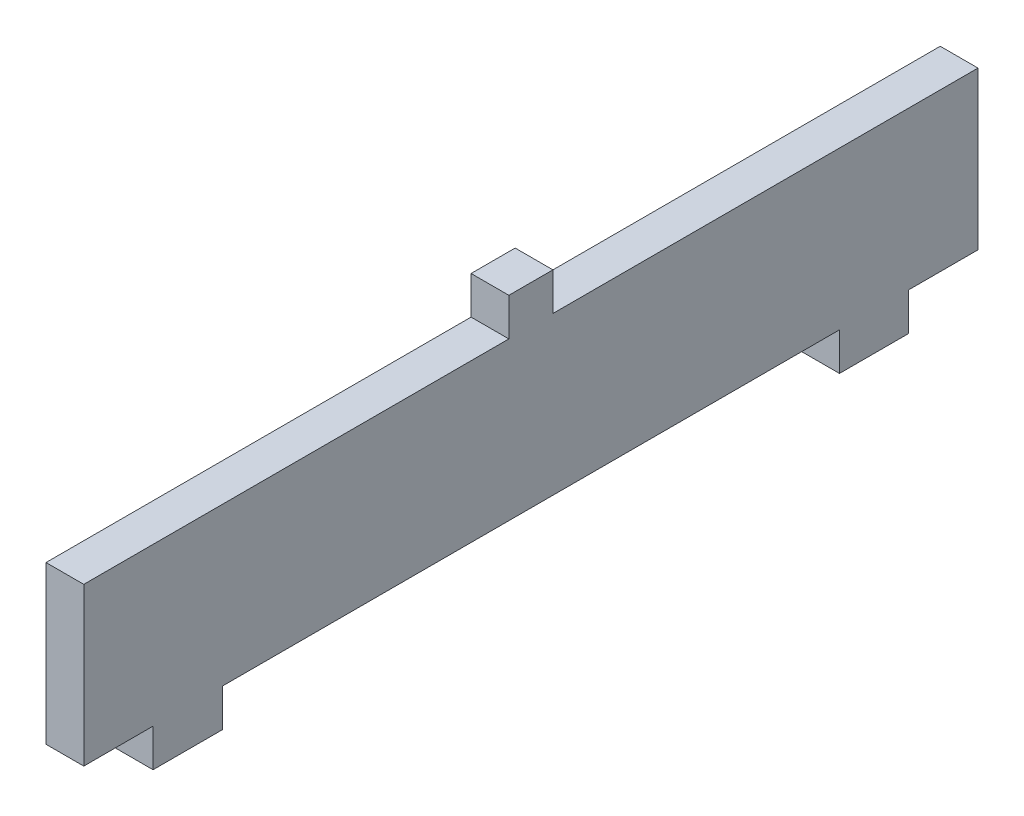
ISO-10303-21;
HEADER;
FILE_DESCRIPTION(('STEP AP214'),'2;1');
FILE_NAME('part.step','',(''),(''),'','','');
FILE_SCHEMA(('AUTOMOTIVE_DESIGN { 1 0 10303 214 1 1 1 1 }'));
ENDSEC;
DATA;
#1=APPLICATION_CONTEXT('core data for automotive mechanical design processes');
#2=APPLICATION_PROTOCOL_DEFINITION('international standard','automotive_design',2000,#1);
#3=PRODUCT_CONTEXT('',#1,'mechanical');
#4=PRODUCT('Part','Part','',(#3));
#5=PRODUCT_RELATED_PRODUCT_CATEGORY('part','',(#4));
#6=PRODUCT_DEFINITION_FORMATION('','',#4);
#7=PRODUCT_DEFINITION_CONTEXT('part definition',#1,'design');
#8=PRODUCT_DEFINITION('design','',#6,#7);
#9=PRODUCT_DEFINITION_SHAPE('','',#8);
#10=(LENGTH_UNIT() NAMED_UNIT(*) SI_UNIT(.MILLI.,.METRE.));
#11=(NAMED_UNIT(*) PLANE_ANGLE_UNIT() SI_UNIT($,.RADIAN.));
#12=(NAMED_UNIT(*) SI_UNIT($,.STERADIAN.) SOLID_ANGLE_UNIT());
#13=UNCERTAINTY_MEASURE_WITH_UNIT(LENGTH_MEASURE(1.E-05),#10,'distance_accuracy_value','');
#14=(GEOMETRIC_REPRESENTATION_CONTEXT(3) GLOBAL_UNCERTAINTY_ASSIGNED_CONTEXT((#13)) GLOBAL_UNIT_ASSIGNED_CONTEXT((#10,
#11,#12)) REPRESENTATION_CONTEXT('',''));
#15=CARTESIAN_POINT('',(0.,0.,0.));
#16=DIRECTION('',(0.,0.,1.));
#17=DIRECTION('',(1.,0.,0.));
#18=AXIS2_PLACEMENT_3D('',#15,#16,#17);
#19=CARTESIAN_POINT('',(3.,-6.25,-35.5));
#20=DIRECTION('',(0.,0.,1.));
#21=DIRECTION('',(1.,0.,0.));
#22=AXIS2_PLACEMENT_3D('',#19,#20,#21);
#23=PLANE('',#22);
#24=DIRECTION('',(0.,1.,0.));
#25=VECTOR('',#24,1.);
#26=CARTESIAN_POINT('',(0.,-6.25,-35.5));
#27=LINE('',#26,#25);
#28=CARTESIAN_POINT('',(0.,-6.25,-35.5));
#29=VERTEX_POINT('',#28);
#30=CARTESIAN_POINT('',(0.,6.25,-35.5));
#31=VERTEX_POINT('',#30);
#32=EDGE_CURVE('E177',#29,#31,#27,.T.);
#33=ORIENTED_EDGE('',*,*,#32,.T.);
#34=DIRECTION('',(-1.,0.,0.));
#35=VECTOR('',#34,1.);
#36=CARTESIAN_POINT('',(3.,6.25,-35.5));
#37=LINE('',#36,#35);
#38=CARTESIAN_POINT('',(3.,6.25,-35.5));
#39=VERTEX_POINT('',#38);
#40=EDGE_CURVE('E11',#39,#31,#37,.T.);
#41=ORIENTED_EDGE('',*,*,#40,.F.);
#42=DIRECTION('',(0.,1.,0.));
#43=VECTOR('',#42,1.);
#44=CARTESIAN_POINT('',(3.,-6.25,-35.5));
#45=LINE('',#44,#43);
#46=CARTESIAN_POINT('',(3.,-6.25,-35.5));
#47=VERTEX_POINT('',#46);
#48=EDGE_CURVE('E207',#47,#39,#45,.T.);
#49=ORIENTED_EDGE('',*,*,#48,.F.);
#50=DIRECTION('',(-1.,0.,0.));
#51=VECTOR('',#50,1.);
#52=CARTESIAN_POINT('',(3.,-6.25,-35.5));
#53=LINE('',#52,#51);
#54=EDGE_CURVE('E173',#47,#29,#53,.T.);
#55=ORIENTED_EDGE('',*,*,#54,.T.);
#56=EDGE_LOOP('',(#33,#41,#49,#55));
#57=FACE_BOUND('',#56,.T.);
#58=ADVANCED_FACE('F33',(#57),#23,.F.);
#59=CARTESIAN_POINT('',(3.,6.25,-1.75));
#60=DIRECTION('',(0.,-1.,0.));
#61=DIRECTION('',(0.,0.,-1.));
#62=AXIS2_PLACEMENT_3D('',#59,#60,#61);
#63=PLANE('',#62);
#64=DIRECTION('',(0.,0.,1.));
#65=VECTOR('',#64,1.);
#66=CARTESIAN_POINT('',(0.,6.25,-1.75));
#67=LINE('',#66,#65);
#68=CARTESIAN_POINT('',(0.,6.25,-1.75));
#69=VERTEX_POINT('',#68);
#70=EDGE_CURVE('E180',#31,#69,#67,.T.);
#71=ORIENTED_EDGE('',*,*,#70,.T.);
#72=DIRECTION('',(-1.,0.,0.));
#73=VECTOR('',#72,1.);
#74=CARTESIAN_POINT('',(3.,6.25,-1.75));
#75=LINE('',#74,#73);
#76=CARTESIAN_POINT('',(3.,6.25,-1.75));
#77=VERTEX_POINT('',#76);
#78=EDGE_CURVE('E41',#77,#69,#75,.T.);
#79=ORIENTED_EDGE('',*,*,#78,.F.);
#80=DIRECTION('',(0.,0.,1.));
#81=VECTOR('',#80,1.);
#82=CARTESIAN_POINT('',(3.,6.25,-1.75));
#83=LINE('',#82,#81);
#84=EDGE_CURVE('E116',#39,#77,#83,.T.);
#85=ORIENTED_EDGE('',*,*,#84,.F.);
#86=ORIENTED_EDGE('',*,*,#40,.T.);
#87=EDGE_LOOP('',(#71,#79,#85,#86));
#88=FACE_BOUND('',#87,.T.);
#89=ADVANCED_FACE('F305',(#88),#63,.F.);
#90=CARTESIAN_POINT('',(3.,6.25,-1.75));
#91=DIRECTION('',(0.,0.,1.));
#92=DIRECTION('',(0.,-1.,0.));
#93=AXIS2_PLACEMENT_3D('',#90,#91,#92);
#94=PLANE('',#93);
#95=DIRECTION('',(0.,1.,0.));
#96=VECTOR('',#95,1.);
#97=CARTESIAN_POINT('',(0.,6.25,-1.75));
#98=LINE('',#97,#96);
#99=CARTESIAN_POINT('',(0.,9.25,-1.75));
#100=VERTEX_POINT('',#99);
#101=EDGE_CURVE('E182',#69,#100,#98,.T.);
#102=ORIENTED_EDGE('',*,*,#101,.T.);
#103=DIRECTION('',(-1.,0.,0.));
#104=VECTOR('',#103,1.);
#105=CARTESIAN_POINT('',(3.,9.25,-1.75));
#106=LINE('',#105,#104);
#107=CARTESIAN_POINT('',(3.,9.25,-1.75));
#108=VERTEX_POINT('',#107);
#109=EDGE_CURVE('E238',#108,#100,#106,.T.);
#110=ORIENTED_EDGE('',*,*,#109,.F.);
#111=DIRECTION('',(0.,1.,0.));
#112=VECTOR('',#111,1.);
#113=CARTESIAN_POINT('',(3.,6.25,-1.75));
#114=LINE('',#113,#112);
#115=EDGE_CURVE('E246',#77,#108,#114,.T.);
#116=ORIENTED_EDGE('',*,*,#115,.F.);
#117=ORIENTED_EDGE('',*,*,#78,.T.);
#118=EDGE_LOOP('',(#102,#110,#116,#117));
#119=FACE_BOUND('',#118,.T.);
#120=ADVANCED_FACE('F244',(#119),#94,.F.);
#121=CARTESIAN_POINT('',(3.,9.25,1.75));
#122=DIRECTION('',(0.,-1.,0.));
#123=DIRECTION('',(0.,0.,-1.));
#124=AXIS2_PLACEMENT_3D('',#121,#122,#123);
#125=PLANE('',#124);
#126=DIRECTION('',(0.,0.,1.));
#127=VECTOR('',#126,1.);
#128=CARTESIAN_POINT('',(0.,9.25,1.75));
#129=LINE('',#128,#127);
#130=CARTESIAN_POINT('',(0.,9.25,1.75));
#131=VERTEX_POINT('',#130);
#132=EDGE_CURVE('E184',#100,#131,#129,.T.);
#133=ORIENTED_EDGE('',*,*,#132,.T.);
#134=DIRECTION('',(-1.,0.,0.));
#135=VECTOR('',#134,1.);
#136=CARTESIAN_POINT('',(3.,9.25,1.75));
#137=LINE('',#136,#135);
#138=CARTESIAN_POINT('',(3.,9.25,1.75));
#139=VERTEX_POINT('',#138);
#140=EDGE_CURVE('E235',#139,#131,#137,.T.);
#141=ORIENTED_EDGE('',*,*,#140,.F.);
#142=DIRECTION('',(0.,0.,1.));
#143=VECTOR('',#142,1.);
#144=CARTESIAN_POINT('',(3.,9.25,1.75));
#145=LINE('',#144,#143);
#146=EDGE_CURVE('E264',#108,#139,#145,.T.);
#147=ORIENTED_EDGE('',*,*,#146,.F.);
#148=ORIENTED_EDGE('',*,*,#109,.T.);
#149=EDGE_LOOP('',(#133,#141,#147,#148));
#150=FACE_BOUND('',#149,.T.);
#151=ADVANCED_FACE('F255',(#150),#125,.F.);
#152=CARTESIAN_POINT('',(3.,6.25,1.75));
#153=DIRECTION('',(0.,0.,-1.));
#154=DIRECTION('',(0.,1.,0.));
#155=AXIS2_PLACEMENT_3D('',#152,#153,#154);
#156=PLANE('',#155);
#157=DIRECTION('',(0.,-1.,0.));
#158=VECTOR('',#157,1.);
#159=CARTESIAN_POINT('',(0.,6.25,1.75));
#160=LINE('',#159,#158);
#161=CARTESIAN_POINT('',(0.,6.25,1.75));
#162=VERTEX_POINT('',#161);
#163=EDGE_CURVE('E186',#131,#162,#160,.T.);
#164=ORIENTED_EDGE('',*,*,#163,.T.);
#165=DIRECTION('',(-1.,0.,0.));
#166=VECTOR('',#165,1.);
#167=CARTESIAN_POINT('',(3.,6.25,1.75));
#168=LINE('',#167,#166);
#169=CARTESIAN_POINT('',(3.,6.25,1.75));
#170=VERTEX_POINT('',#169);
#171=EDGE_CURVE('E232',#170,#162,#168,.T.);
#172=ORIENTED_EDGE('',*,*,#171,.F.);
#173=DIRECTION('',(0.,-1.,0.));
#174=VECTOR('',#173,1.);
#175=CARTESIAN_POINT('',(3.,6.25,1.75));
#176=LINE('',#175,#174);
#177=EDGE_CURVE('E261',#139,#170,#176,.T.);
#178=ORIENTED_EDGE('',*,*,#177,.F.);
#179=ORIENTED_EDGE('',*,*,#140,.T.);
#180=EDGE_LOOP('',(#164,#172,#178,#179));
#181=FACE_BOUND('',#180,.T.);
#182=ADVANCED_FACE('F259',(#181),#156,.F.);
#183=CARTESIAN_POINT('',(3.,6.25,35.5));
#184=DIRECTION('',(0.,-1.,0.));
#185=DIRECTION('',(0.,0.,-1.));
#186=AXIS2_PLACEMENT_3D('',#183,#184,#185);
#187=PLANE('',#186);
#188=DIRECTION('',(0.,0.,1.));
#189=VECTOR('',#188,1.);
#190=CARTESIAN_POINT('',(0.,6.25,35.5));
#191=LINE('',#190,#189);
#192=CARTESIAN_POINT('',(0.,6.25,35.5));
#193=VERTEX_POINT('',#192);
#194=EDGE_CURVE('E188',#162,#193,#191,.T.);
#195=ORIENTED_EDGE('',*,*,#194,.T.);
#196=DIRECTION('',(-1.,0.,0.));
#197=VECTOR('',#196,1.);
#198=CARTESIAN_POINT('',(3.,6.25,35.5));
#199=LINE('',#198,#197);
#200=CARTESIAN_POINT('',(3.,6.25,35.5));
#201=VERTEX_POINT('',#200);
#202=EDGE_CURVE('E229',#201,#193,#199,.T.);
#203=ORIENTED_EDGE('',*,*,#202,.F.);
#204=DIRECTION('',(0.,0.,1.));
#205=VECTOR('',#204,1.);
#206=CARTESIAN_POINT('',(3.,6.25,35.5));
#207=LINE('',#206,#205);
#208=EDGE_CURVE('E263',#170,#201,#207,.T.);
#209=ORIENTED_EDGE('',*,*,#208,.F.);
#210=ORIENTED_EDGE('',*,*,#171,.T.);
#211=EDGE_LOOP('',(#195,#203,#209,#210));
#212=FACE_BOUND('',#211,.T.);
#213=ADVANCED_FACE('F318',(#212),#187,.F.);
#214=CARTESIAN_POINT('',(3.,-6.25,35.5));
#215=DIRECTION('',(0.,0.,-1.));
#216=DIRECTION('',(-1.,0.,0.));
#217=AXIS2_PLACEMENT_3D('',#214,#215,#216);
#218=PLANE('',#217);
#219=DIRECTION('',(0.,-1.,0.));
#220=VECTOR('',#219,1.);
#221=CARTESIAN_POINT('',(0.,-6.25,35.5));
#222=LINE('',#221,#220);
#223=CARTESIAN_POINT('',(0.,-6.25,35.5));
#224=VERTEX_POINT('',#223);
#225=EDGE_CURVE('E190',#193,#224,#222,.T.);
#226=ORIENTED_EDGE('',*,*,#225,.T.);
#227=DIRECTION('',(-1.,0.,0.));
#228=VECTOR('',#227,1.);
#229=CARTESIAN_POINT('',(3.,-6.25,35.5));
#230=LINE('',#229,#228);
#231=CARTESIAN_POINT('',(3.,-6.25,35.5));
#232=VERTEX_POINT('',#231);
#233=EDGE_CURVE('E226',#232,#224,#230,.T.);
#234=ORIENTED_EDGE('',*,*,#233,.F.);
#235=DIRECTION('',(0.,-1.,0.));
#236=VECTOR('',#235,1.);
#237=CARTESIAN_POINT('',(3.,-6.25,35.5));
#238=LINE('',#237,#236);
#239=EDGE_CURVE('E266',#201,#232,#238,.T.);
#240=ORIENTED_EDGE('',*,*,#239,.F.);
#241=ORIENTED_EDGE('',*,*,#202,.T.);
#242=EDGE_LOOP('',(#226,#234,#240,#241));
#243=FACE_BOUND('',#242,.T.);
#244=ADVANCED_FACE('F321',(#243),#218,.F.);
#245=CARTESIAN_POINT('',(3.,-6.25,35.5));
#246=DIRECTION('',(0.,1.,0.));
#247=DIRECTION('',(0.,0.,1.));
#248=AXIS2_PLACEMENT_3D('',#245,#246,#247);
#249=PLANE('',#248);
#250=DIRECTION('',(0.,0.,-1.));
#251=VECTOR('',#250,1.);
#252=CARTESIAN_POINT('',(0.,-6.25,35.5));
#253=LINE('',#252,#251);
#254=CARTESIAN_POINT('',(0.,-6.25,30.));
#255=VERTEX_POINT('',#254);
#256=EDGE_CURVE('E192',#224,#255,#253,.T.);
#257=ORIENTED_EDGE('',*,*,#256,.T.);
#258=DIRECTION('',(-1.,0.,0.));
#259=VECTOR('',#258,1.);
#260=CARTESIAN_POINT('',(3.,-6.25,30.));
#261=LINE('',#260,#259);
#262=CARTESIAN_POINT('',(3.,-6.25,30.));
#263=VERTEX_POINT('',#262);
#264=EDGE_CURVE('E223',#263,#255,#261,.T.);
#265=ORIENTED_EDGE('',*,*,#264,.F.);
#266=DIRECTION('',(0.,0.,-1.));
#267=VECTOR('',#266,1.);
#268=CARTESIAN_POINT('',(3.,-6.25,35.5));
#269=LINE('',#268,#267);
#270=EDGE_CURVE('E272',#232,#263,#269,.T.);
#271=ORIENTED_EDGE('',*,*,#270,.F.);
#272=ORIENTED_EDGE('',*,*,#233,.T.);
#273=EDGE_LOOP('',(#257,#265,#271,#272));
#274=FACE_BOUND('',#273,.T.);
#275=ADVANCED_FACE('F325',(#274),#249,.F.);
#276=CARTESIAN_POINT('',(3.,-6.25,30.));
#277=DIRECTION('',(0.,0.,-1.));
#278=DIRECTION('',(-1.,0.,0.));
#279=AXIS2_PLACEMENT_3D('',#276,#277,#278);
#280=PLANE('',#279);
#281=DIRECTION('',(0.,-1.,0.));
#282=VECTOR('',#281,1.);
#283=CARTESIAN_POINT('',(0.,-6.25,30.));
#284=LINE('',#283,#282);
#285=CARTESIAN_POINT('',(0.,-9.24999999999996,30.));
#286=VERTEX_POINT('',#285);
#287=EDGE_CURVE('E194',#255,#286,#284,.T.);
#288=ORIENTED_EDGE('',*,*,#287,.T.);
#289=DIRECTION('',(-1.,0.,0.));
#290=VECTOR('',#289,1.);
#291=CARTESIAN_POINT('',(3.,-9.24999999999996,30.));
#292=LINE('',#291,#290);
#293=CARTESIAN_POINT('',(3.,-9.24999999999996,30.));
#294=VERTEX_POINT('',#293);
#295=EDGE_CURVE('E220',#294,#286,#292,.T.);
#296=ORIENTED_EDGE('',*,*,#295,.F.);
#297=DIRECTION('',(0.,-1.,0.));
#298=VECTOR('',#297,1.);
#299=CARTESIAN_POINT('',(3.,-6.25,30.));
#300=LINE('',#299,#298);
#301=EDGE_CURVE('E274',#263,#294,#300,.T.);
#302=ORIENTED_EDGE('',*,*,#301,.F.);
#303=ORIENTED_EDGE('',*,*,#264,.T.);
#304=EDGE_LOOP('',(#288,#296,#302,#303));
#305=FACE_BOUND('',#304,.T.);
#306=ADVANCED_FACE('F329',(#305),#280,.F.);
#307=CARTESIAN_POINT('',(3.,-9.24999999999996,30.));
#308=DIRECTION('',(0.,1.,0.));
#309=DIRECTION('',(0.,0.,1.));
#310=AXIS2_PLACEMENT_3D('',#307,#308,#309);
#311=PLANE('',#310);
#312=DIRECTION('',(0.,0.,-1.));
#313=VECTOR('',#312,1.);
#314=CARTESIAN_POINT('',(0.,-9.24999999999996,30.));
#315=LINE('',#314,#313);
#316=CARTESIAN_POINT('',(0.,-9.24999999999996,24.5));
#317=VERTEX_POINT('',#316);
#318=EDGE_CURVE('E196',#286,#317,#315,.T.);
#319=ORIENTED_EDGE('',*,*,#318,.T.);
#320=DIRECTION('',(-1.,0.,0.));
#321=VECTOR('',#320,1.);
#322=CARTESIAN_POINT('',(3.,-9.24999999999996,24.5));
#323=LINE('',#322,#321);
#324=CARTESIAN_POINT('',(3.,-9.24999999999996,24.5));
#325=VERTEX_POINT('',#324);
#326=EDGE_CURVE('E217',#325,#317,#323,.T.);
#327=ORIENTED_EDGE('',*,*,#326,.F.);
#328=DIRECTION('',(0.,0.,-1.));
#329=VECTOR('',#328,1.);
#330=CARTESIAN_POINT('',(3.,-9.24999999999996,30.));
#331=LINE('',#330,#329);
#332=EDGE_CURVE('E276',#294,#325,#331,.T.);
#333=ORIENTED_EDGE('',*,*,#332,.F.);
#334=ORIENTED_EDGE('',*,*,#295,.T.);
#335=EDGE_LOOP('',(#319,#327,#333,#334));
#336=FACE_BOUND('',#335,.T.);
#337=ADVANCED_FACE('F333',(#336),#311,.F.);
#338=CARTESIAN_POINT('',(3.,-6.25,24.5));
#339=DIRECTION('',(0.,0.,1.));
#340=DIRECTION('',(1.,0.,0.));
#341=AXIS2_PLACEMENT_3D('',#338,#339,#340);
#342=PLANE('',#341);
#343=DIRECTION('',(0.,1.,0.));
#344=VECTOR('',#343,1.);
#345=CARTESIAN_POINT('',(0.,-6.25,24.5));
#346=LINE('',#345,#344);
#347=CARTESIAN_POINT('',(0.,-6.25,24.5));
#348=VERTEX_POINT('',#347);
#349=EDGE_CURVE('E198',#317,#348,#346,.T.);
#350=ORIENTED_EDGE('',*,*,#349,.T.);
#351=DIRECTION('',(-1.,0.,0.));
#352=VECTOR('',#351,1.);
#353=CARTESIAN_POINT('',(3.,-6.25,24.5));
#354=LINE('',#353,#352);
#355=CARTESIAN_POINT('',(3.,-6.25,24.5));
#356=VERTEX_POINT('',#355);
#357=EDGE_CURVE('E214',#356,#348,#354,.T.);
#358=ORIENTED_EDGE('',*,*,#357,.F.);
#359=DIRECTION('',(0.,1.,0.));
#360=VECTOR('',#359,1.);
#361=CARTESIAN_POINT('',(3.,-6.25,24.5));
#362=LINE('',#361,#360);
#363=EDGE_CURVE('E278',#325,#356,#362,.T.);
#364=ORIENTED_EDGE('',*,*,#363,.F.);
#365=ORIENTED_EDGE('',*,*,#326,.T.);
#366=EDGE_LOOP('',(#350,#358,#364,#365));
#367=FACE_BOUND('',#366,.T.);
#368=ADVANCED_FACE('F337',(#367),#342,.F.);
#369=CARTESIAN_POINT('',(3.,-6.25,24.5));
#370=DIRECTION('',(0.,1.,0.));
#371=DIRECTION('',(0.,0.,1.));
#372=AXIS2_PLACEMENT_3D('',#369,#370,#371);
#373=PLANE('',#372);
#374=DIRECTION('',(0.,0.,-1.));
#375=VECTOR('',#374,1.);
#376=CARTESIAN_POINT('',(0.,-6.25,24.5));
#377=LINE('',#376,#375);
#378=CARTESIAN_POINT('',(0.,-6.24999999999997,-24.5));
#379=VERTEX_POINT('',#378);
#380=EDGE_CURVE('E200',#348,#379,#377,.T.);
#381=ORIENTED_EDGE('',*,*,#380,.T.);
#382=DIRECTION('',(-1.,0.,0.));
#383=VECTOR('',#382,1.);
#384=CARTESIAN_POINT('',(3.,-6.24999999999997,-24.5));
#385=LINE('',#384,#383);
#386=CARTESIAN_POINT('',(3.,-6.24999999999997,-24.5));
#387=VERTEX_POINT('',#386);
#388=EDGE_CURVE('E211',#387,#379,#385,.T.);
#389=ORIENTED_EDGE('',*,*,#388,.F.);
#390=DIRECTION('',(0.,0.,-1.));
#391=VECTOR('',#390,1.);
#392=CARTESIAN_POINT('',(3.,-6.25,24.5));
#393=LINE('',#392,#391);
#394=EDGE_CURVE('E280',#356,#387,#393,.T.);
#395=ORIENTED_EDGE('',*,*,#394,.F.);
#396=ORIENTED_EDGE('',*,*,#357,.T.);
#397=EDGE_LOOP('',(#381,#389,#395,#396));
#398=FACE_BOUND('',#397,.T.);
#399=ADVANCED_FACE('F286',(#398),#373,.F.);
#400=CARTESIAN_POINT('',(3.,-6.24999999999997,-24.5));
#401=DIRECTION('',(0.,0.,-1.));
#402=DIRECTION('',(-1.,0.,0.));
#403=AXIS2_PLACEMENT_3D('',#400,#401,#402);
#404=PLANE('',#403);
#405=DIRECTION('',(0.,-1.,0.));
#406=VECTOR('',#405,1.);
#407=CARTESIAN_POINT('',(0.,-6.24999999999997,-24.5));
#408=LINE('',#407,#406);
#409=CARTESIAN_POINT('',(0.,-9.24999999999996,-24.5));
#410=VERTEX_POINT('',#409);
#411=EDGE_CURVE('E202',#379,#410,#408,.T.);
#412=ORIENTED_EDGE('',*,*,#411,.T.);
#413=DIRECTION('',(-1.,0.,0.));
#414=VECTOR('',#413,1.);
#415=CARTESIAN_POINT('',(3.,-9.24999999999996,-24.5));
#416=LINE('',#415,#414);
#417=CARTESIAN_POINT('',(3.,-9.24999999999996,-24.5));
#418=VERTEX_POINT('',#417);
#419=EDGE_CURVE('E168',#418,#410,#416,.T.);
#420=ORIENTED_EDGE('',*,*,#419,.F.);
#421=DIRECTION('',(0.,-1.,0.));
#422=VECTOR('',#421,1.);
#423=CARTESIAN_POINT('',(3.,-6.24999999999997,-24.5));
#424=LINE('',#423,#422);
#425=EDGE_CURVE('E159',#387,#418,#424,.T.);
#426=ORIENTED_EDGE('',*,*,#425,.F.);
#427=ORIENTED_EDGE('',*,*,#388,.T.);
#428=EDGE_LOOP('',(#412,#420,#426,#427));
#429=FACE_BOUND('',#428,.T.);
#430=ADVANCED_FACE('F290',(#429),#404,.F.);
#431=CARTESIAN_POINT('',(3.,-9.24999999999996,-24.5));
#432=DIRECTION('',(0.,1.,0.));
#433=DIRECTION('',(0.,0.,1.));
#434=AXIS2_PLACEMENT_3D('',#431,#432,#433);
#435=PLANE('',#434);
#436=DIRECTION('',(0.,0.,-1.));
#437=VECTOR('',#436,1.);
#438=CARTESIAN_POINT('',(0.,-9.24999999999996,-24.5));
#439=LINE('',#438,#437);
#440=CARTESIAN_POINT('',(0.,-9.24999999999996,-30.));
#441=VERTEX_POINT('',#440);
#442=EDGE_CURVE('E167',#410,#441,#439,.T.);
#443=ORIENTED_EDGE('',*,*,#442,.T.);
#444=DIRECTION('',(-1.,0.,0.));
#445=VECTOR('',#444,1.);
#446=CARTESIAN_POINT('',(3.,-9.24999999999996,-30.));
#447=LINE('',#446,#445);
#448=CARTESIAN_POINT('',(3.,-9.24999999999996,-30.));
#449=VERTEX_POINT('',#448);
#450=EDGE_CURVE('E164',#449,#441,#447,.T.);
#451=ORIENTED_EDGE('',*,*,#450,.F.);
#452=DIRECTION('',(0.,0.,-1.));
#453=VECTOR('',#452,1.);
#454=CARTESIAN_POINT('',(3.,-9.24999999999996,-24.5));
#455=LINE('',#454,#453);
#456=EDGE_CURVE('E153',#418,#449,#455,.T.);
#457=ORIENTED_EDGE('',*,*,#456,.F.);
#458=ORIENTED_EDGE('',*,*,#419,.T.);
#459=EDGE_LOOP('',(#443,#451,#457,#458));
#460=FACE_BOUND('',#459,.T.);
#461=ADVANCED_FACE('F165',(#460),#435,.F.);
#462=CARTESIAN_POINT('',(3.,-6.24999999999996,-30.));
#463=DIRECTION('',(0.,0.,1.));
#464=DIRECTION('',(1.,0.,0.));
#465=AXIS2_PLACEMENT_3D('',#462,#463,#464);
#466=PLANE('',#465);
#467=DIRECTION('',(0.,1.,0.));
#468=VECTOR('',#467,1.);
#469=CARTESIAN_POINT('',(0.,-6.24999999999996,-30.));
#470=LINE('',#469,#468);
#471=CARTESIAN_POINT('',(0.,-6.24999999999996,-30.));
#472=VERTEX_POINT('',#471);
#473=EDGE_CURVE('E102',#441,#472,#470,.T.);
#474=ORIENTED_EDGE('',*,*,#473,.T.);
#475=DIRECTION('',(-1.,0.,0.));
#476=VECTOR('',#475,1.);
#477=CARTESIAN_POINT('',(3.,-6.24999999999996,-30.));
#478=LINE('',#477,#476);
#479=CARTESIAN_POINT('',(3.,-6.24999999999996,-30.));
#480=VERTEX_POINT('',#479);
#481=EDGE_CURVE('E169',#480,#472,#478,.T.);
#482=ORIENTED_EDGE('',*,*,#481,.F.);
#483=DIRECTION('',(0.,1.,0.));
#484=VECTOR('',#483,1.);
#485=CARTESIAN_POINT('',(3.,-6.24999999999996,-30.));
#486=LINE('',#485,#484);
#487=EDGE_CURVE('E157',#449,#480,#486,.T.);
#488=ORIENTED_EDGE('',*,*,#487,.F.);
#489=ORIENTED_EDGE('',*,*,#450,.T.);
#490=EDGE_LOOP('',(#474,#482,#488,#489));
#491=FACE_BOUND('',#490,.T.);
#492=ADVANCED_FACE('F171',(#491),#466,.F.);
#493=CARTESIAN_POINT('',(3.,-6.24999999999996,-30.));
#494=DIRECTION('',(0.,1.,0.));
#495=DIRECTION('',(0.,0.,1.));
#496=AXIS2_PLACEMENT_3D('',#493,#494,#495);
#497=PLANE('',#496);
#498=DIRECTION('',(0.,0.,-1.));
#499=VECTOR('',#498,1.);
#500=CARTESIAN_POINT('',(0.,-6.24999999999996,-30.));
#501=LINE('',#500,#499);
#502=EDGE_CURVE('E108',#472,#29,#501,.T.);
#503=ORIENTED_EDGE('',*,*,#502,.T.);
#504=ORIENTED_EDGE('',*,*,#54,.F.);
#505=DIRECTION('',(0.,0.,-1.));
#506=VECTOR('',#505,1.);
#507=CARTESIAN_POINT('',(3.,-6.24999999999996,-30.));
#508=LINE('',#507,#506);
#509=EDGE_CURVE('E49',#480,#47,#508,.T.);
#510=ORIENTED_EDGE('',*,*,#509,.F.);
#511=ORIENTED_EDGE('',*,*,#481,.T.);
#512=EDGE_LOOP('',(#503,#504,#510,#511));
#513=FACE_BOUND('',#512,.T.);
#514=ADVANCED_FACE('F294',(#513),#497,.F.);
#515=CARTESIAN_POINT('',(3.,0.,0.));
#516=DIRECTION('',(-1.,0.,0.));
#517=DIRECTION('',(0.,0.,1.));
#518=AXIS2_PLACEMENT_3D('',#515,#516,#517);
#519=PLANE('',#518);
#520=ORIENTED_EDGE('',*,*,#48,.T.);
#521=ORIENTED_EDGE('',*,*,#84,.T.);
#522=ORIENTED_EDGE('',*,*,#115,.T.);
#523=ORIENTED_EDGE('',*,*,#146,.T.);
#524=ORIENTED_EDGE('',*,*,#177,.T.);
#525=ORIENTED_EDGE('',*,*,#208,.T.);
#526=ORIENTED_EDGE('',*,*,#239,.T.);
#527=ORIENTED_EDGE('',*,*,#270,.T.);
#528=ORIENTED_EDGE('',*,*,#301,.T.);
#529=ORIENTED_EDGE('',*,*,#332,.T.);
#530=ORIENTED_EDGE('',*,*,#363,.T.);
#531=ORIENTED_EDGE('',*,*,#394,.T.);
#532=ORIENTED_EDGE('',*,*,#425,.T.);
#533=ORIENTED_EDGE('',*,*,#456,.T.);
#534=ORIENTED_EDGE('',*,*,#487,.T.);
#535=ORIENTED_EDGE('',*,*,#509,.T.);
#536=EDGE_LOOP('',(#520,#521,#522,#523,#524,#525,#526,#527,#528,#529,#530,#531,#532,#533,#534,#535));
#537=FACE_BOUND('',#536,.T.);
#538=ADVANCED_FACE('F155',(#537),#519,.F.);
#539=CARTESIAN_POINT('',(0.,0.,0.));
#540=DIRECTION('',(-1.,0.,0.));
#541=DIRECTION('',(0.,0.,1.));
#542=AXIS2_PLACEMENT_3D('',#539,#540,#541);
#543=PLANE('',#542);
#544=ORIENTED_EDGE('',*,*,#32,.F.);
#545=ORIENTED_EDGE('',*,*,#502,.F.);
#546=ORIENTED_EDGE('',*,*,#473,.F.);
#547=ORIENTED_EDGE('',*,*,#442,.F.);
#548=ORIENTED_EDGE('',*,*,#411,.F.);
#549=ORIENTED_EDGE('',*,*,#380,.F.);
#550=ORIENTED_EDGE('',*,*,#349,.F.);
#551=ORIENTED_EDGE('',*,*,#318,.F.);
#552=ORIENTED_EDGE('',*,*,#287,.F.);
#553=ORIENTED_EDGE('',*,*,#256,.F.);
#554=ORIENTED_EDGE('',*,*,#225,.F.);
#555=ORIENTED_EDGE('',*,*,#194,.F.);
#556=ORIENTED_EDGE('',*,*,#163,.F.);
#557=ORIENTED_EDGE('',*,*,#132,.F.);
#558=ORIENTED_EDGE('',*,*,#101,.F.);
#559=ORIENTED_EDGE('',*,*,#70,.F.);
#560=EDGE_LOOP('',(#544,#545,#546,#547,#548,#549,#550,#551,#552,#553,#554,#555,#556,#557,#558,#559));
#561=FACE_BOUND('',#560,.T.);
#562=ADVANCED_FACE('F250',(#561),#543,.T.);
#563=CLOSED_SHELL('',(#58,#89,#120,#151,#182,#213,#244,#275,#306,#337,#368,#399,#430,#461,#492,
#514,#538,#562));
#564=MANIFOLD_SOLID_BREP('B2',#563);
#565=ADVANCED_BREP_SHAPE_REPRESENTATION('',(#18,#564),#14);
#566=SHAPE_DEFINITION_REPRESENTATION(#9,#565);
ENDSEC;
END-ISO-10303-21;
